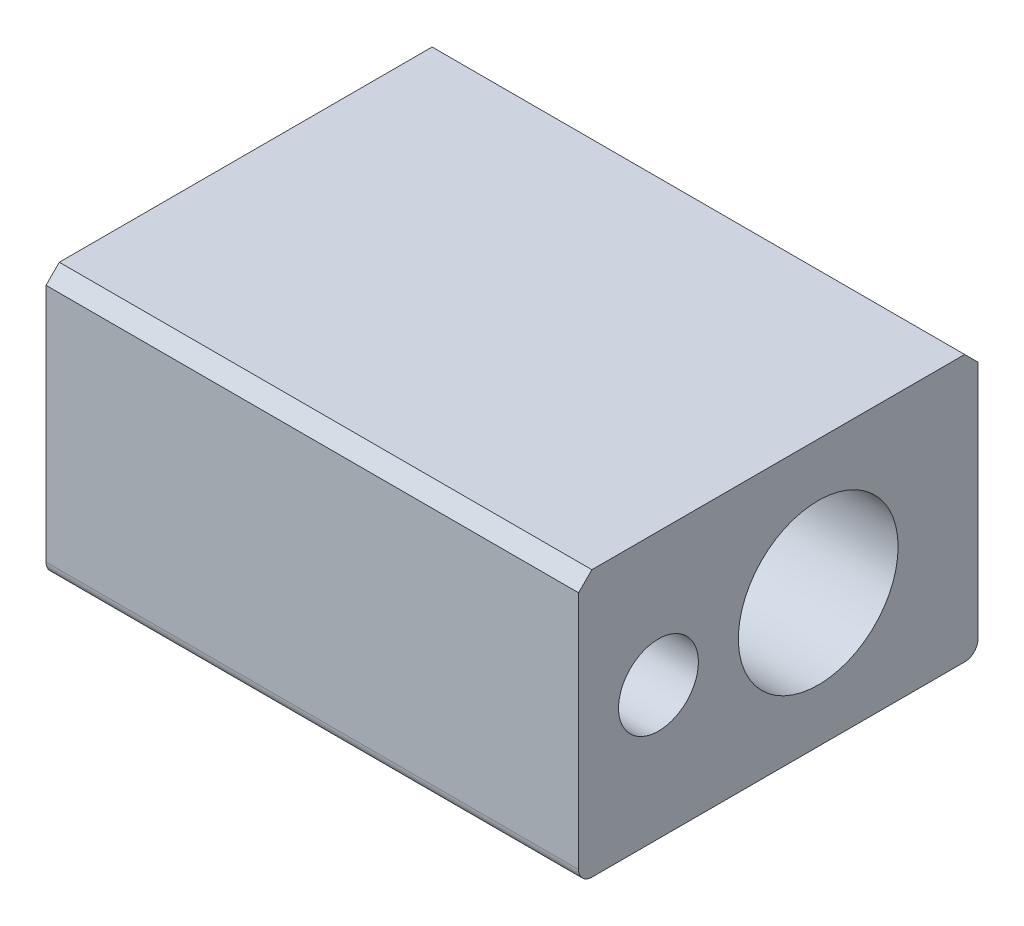
ISO-10303-21;
HEADER;
FILE_DESCRIPTION(('STEP AP214'),'2;1');
FILE_NAME('part.step','',(''),(''),'','','');
FILE_SCHEMA(('AUTOMOTIVE_DESIGN { 1 0 10303 214 1 1 1 1 }'));
ENDSEC;
DATA;
#1=APPLICATION_CONTEXT('core data for automotive mechanical design processes');
#2=APPLICATION_PROTOCOL_DEFINITION('international standard','automotive_design',2000,#1);
#3=PRODUCT_CONTEXT('',#1,'mechanical');
#4=PRODUCT('Part','Part','',(#3));
#5=PRODUCT_RELATED_PRODUCT_CATEGORY('part','',(#4));
#6=PRODUCT_DEFINITION_FORMATION('','',#4);
#7=PRODUCT_DEFINITION_CONTEXT('part definition',#1,'design');
#8=PRODUCT_DEFINITION('design','',#6,#7);
#9=PRODUCT_DEFINITION_SHAPE('','',#8);
#10=(LENGTH_UNIT() NAMED_UNIT(*) SI_UNIT(.MILLI.,.METRE.));
#11=(NAMED_UNIT(*) PLANE_ANGLE_UNIT() SI_UNIT($,.RADIAN.));
#12=(NAMED_UNIT(*) SI_UNIT($,.STERADIAN.) SOLID_ANGLE_UNIT());
#13=UNCERTAINTY_MEASURE_WITH_UNIT(LENGTH_MEASURE(1.E-05),#10,'distance_accuracy_value','');
#14=(GEOMETRIC_REPRESENTATION_CONTEXT(3) GLOBAL_UNCERTAINTY_ASSIGNED_CONTEXT((#13)) GLOBAL_UNIT_ASSIGNED_CONTEXT((#10,
#11,#12)) REPRESENTATION_CONTEXT('',''));
#15=CARTESIAN_POINT('',(0.,0.,0.));
#16=DIRECTION('',(0.,0.,1.));
#17=DIRECTION('',(1.,0.,0.));
#18=AXIS2_PLACEMENT_3D('',#15,#16,#17);
#19=CARTESIAN_POINT('',(101.6,0.,0.));
#20=DIRECTION('',(1.,0.,0.));
#21=DIRECTION('',(0.,0.,-1.));
#22=AXIS2_PLACEMENT_3D('',#19,#20,#21);
#23=PLANE('',#22);
#24=CARTESIAN_POINT('',(101.6,0.,-7.62000000000001));
#25=DIRECTION('',(1.,0.,0.));
#26=DIRECTION('',(0.,0.,-1.));
#27=AXIS2_PLACEMENT_3D('',#24,#25,#26);
#28=CIRCLE('',#27,15.24);
#29=CARTESIAN_POINT('',(101.6,0.,-22.86));
#30=VERTEX_POINT('',#29);
#31=EDGE_CURVE('E150',#30,#30,#28,.T.);
#32=ORIENTED_EDGE('',*,*,#31,.F.);
#33=EDGE_LOOP('',(#32));
#34=FACE_BOUND('',#33,.T.);
#35=DIRECTION('',(0.,1.,0.));
#36=VECTOR('',#35,1.);
#37=CARTESIAN_POINT('',(101.6,25.4,-38.1));
#38=LINE('',#37,#36);
#39=CARTESIAN_POINT('',(101.6,-22.86,-38.1));
#40=VERTEX_POINT('',#39);
#41=CARTESIAN_POINT('',(101.6,22.86,-38.1));
#42=VERTEX_POINT('',#41);
#43=EDGE_CURVE('E133',#40,#42,#38,.T.);
#44=ORIENTED_EDGE('',*,*,#43,.T.);
#45=DIRECTION('',(0.,-0.707106781186549,-0.707106781186546));
#46=VECTOR('',#45,1.);
#47=CARTESIAN_POINT('',(101.6,30.4799999999999,-30.4800000000001));
#48=LINE('',#47,#46);
#49=CARTESIAN_POINT('',(101.6,25.4,-35.56));
#50=VERTEX_POINT('',#49);
#51=EDGE_CURVE('E57',#42,#50,#48,.F.);
#52=ORIENTED_EDGE('',*,*,#51,.T.);
#53=DIRECTION('',(0.,0.,1.));
#54=VECTOR('',#53,1.);
#55=CARTESIAN_POINT('',(101.6,25.4,-38.1));
#56=LINE('',#55,#54);
#57=CARTESIAN_POINT('',(101.6,25.4,35.56));
#58=VERTEX_POINT('',#57);
#59=EDGE_CURVE('E194',#50,#58,#56,.T.);
#60=ORIENTED_EDGE('',*,*,#59,.T.);
#61=DIRECTION('',(0.,0.707106781186545,-0.70710678118655));
#62=VECTOR('',#61,1.);
#63=CARTESIAN_POINT('',(101.6,30.4800000000001,30.4799999999999));
#64=LINE('',#63,#62);
#65=CARTESIAN_POINT('',(101.6,22.86,38.1));
#66=VERTEX_POINT('',#65);
#67=EDGE_CURVE('E64',#58,#66,#64,.F.);
#68=ORIENTED_EDGE('',*,*,#67,.T.);
#69=DIRECTION('',(0.,-1.,0.));
#70=VECTOR('',#69,1.);
#71=CARTESIAN_POINT('',(101.6,25.4,38.1));
#72=LINE('',#71,#70);
#73=CARTESIAN_POINT('',(101.6,-22.86,38.1));
#74=VERTEX_POINT('',#73);
#75=EDGE_CURVE('E135',#66,#74,#72,.T.);
#76=ORIENTED_EDGE('',*,*,#75,.T.);
#77=CARTESIAN_POINT('',(101.6,-22.86,35.56));
#78=DIRECTION('',(1.,0.,0.));
#79=DIRECTION('',(0.,0.,-1.));
#80=AXIS2_PLACEMENT_3D('',#77,#78,#79);
#81=CIRCLE('',#80,2.54);
#82=CARTESIAN_POINT('',(101.6,-25.4,35.56));
#83=VERTEX_POINT('',#82);
#84=EDGE_CURVE('E165',#74,#83,#81,.T.);
#85=ORIENTED_EDGE('',*,*,#84,.T.);
#86=DIRECTION('',(0.,0.,-1.));
#87=VECTOR('',#86,1.);
#88=CARTESIAN_POINT('',(101.6,-25.4,-38.1));
#89=LINE('',#88,#87);
#90=CARTESIAN_POINT('',(101.6,-25.4,-35.56));
#91=VERTEX_POINT('',#90);
#92=EDGE_CURVE('E155',#83,#91,#89,.T.);
#93=ORIENTED_EDGE('',*,*,#92,.T.);
#94=CARTESIAN_POINT('',(101.6,-22.86,-35.56));
#95=DIRECTION('',(1.,0.,0.));
#96=DIRECTION('',(0.,0.,-1.));
#97=AXIS2_PLACEMENT_3D('',#94,#95,#96);
#98=CIRCLE('',#97,2.54);
#99=EDGE_CURVE('E168',#91,#40,#98,.T.);
#100=ORIENTED_EDGE('',*,*,#99,.T.);
#101=EDGE_LOOP('',(#44,#52,#60,#68,#76,#85,#93,#100));
#102=FACE_BOUND('',#101,.T.);
#103=CARTESIAN_POINT('',(101.6,0.,22.86));
#104=DIRECTION('',(1.,0.,0.));
#105=DIRECTION('',(0.,0.,-1.));
#106=AXIS2_PLACEMENT_3D('',#103,#104,#105);
#107=CIRCLE('',#106,7.62);
#108=CARTESIAN_POINT('',(101.6,0.,15.24));
#109=VERTEX_POINT('',#108);
#110=EDGE_CURVE('E250',#109,#109,#107,.T.);
#111=ORIENTED_EDGE('',*,*,#110,.F.);
#112=EDGE_LOOP('',(#111));
#113=FACE_BOUND('',#112,.T.);
#114=ADVANCED_FACE('F47',(#34,#102,#113),#23,.T.);
#115=CARTESIAN_POINT('',(0.,0.,0.));
#116=DIRECTION('',(1.,0.,0.));
#117=DIRECTION('',(0.,0.,-1.));
#118=AXIS2_PLACEMENT_3D('',#115,#116,#117);
#119=PLANE('',#118);
#120=DIRECTION('',(0.,0.,1.));
#121=VECTOR('',#120,1.);
#122=CARTESIAN_POINT('',(0.,25.4,-38.1));
#123=LINE('',#122,#121);
#124=CARTESIAN_POINT('',(0.,25.4,-35.56));
#125=VERTEX_POINT('',#124);
#126=CARTESIAN_POINT('',(0.,25.4,35.56));
#127=VERTEX_POINT('',#126);
#128=EDGE_CURVE('E142',#125,#127,#123,.T.);
#129=ORIENTED_EDGE('',*,*,#128,.F.);
#130=DIRECTION('',(0.,0.707106781186549,0.707106781186546));
#131=VECTOR('',#130,1.);
#132=CARTESIAN_POINT('',(0.,25.4,-35.56));
#133=LINE('',#132,#131);
#134=CARTESIAN_POINT('',(0.,22.86,-38.1));
#135=VERTEX_POINT('',#134);
#136=EDGE_CURVE('E140',#125,#135,#133,.F.);
#137=ORIENTED_EDGE('',*,*,#136,.T.);
#138=DIRECTION('',(0.,1.,0.));
#139=VECTOR('',#138,1.);
#140=CARTESIAN_POINT('',(0.,25.4,-38.1));
#141=LINE('',#140,#139);
#142=CARTESIAN_POINT('',(0.,-22.86,-38.1));
#143=VERTEX_POINT('',#142);
#144=EDGE_CURVE('E132',#143,#135,#141,.T.);
#145=ORIENTED_EDGE('',*,*,#144,.F.);
#146=CARTESIAN_POINT('',(0.,-22.86,-35.56));
#147=DIRECTION('',(1.,0.,0.));
#148=DIRECTION('',(0.,0.,-1.));
#149=AXIS2_PLACEMENT_3D('',#146,#147,#148);
#150=CIRCLE('',#149,2.54);
#151=CARTESIAN_POINT('',(0.,-25.4,-35.56));
#152=VERTEX_POINT('',#151);
#153=EDGE_CURVE('E117',#143,#152,#150,.F.);
#154=ORIENTED_EDGE('',*,*,#153,.T.);
#155=DIRECTION('',(0.,0.,-1.));
#156=VECTOR('',#155,1.);
#157=CARTESIAN_POINT('',(0.,-25.4,-38.1));
#158=LINE('',#157,#156);
#159=CARTESIAN_POINT('',(0.,-25.4,35.56));
#160=VERTEX_POINT('',#159);
#161=EDGE_CURVE('E143',#160,#152,#158,.T.);
#162=ORIENTED_EDGE('',*,*,#161,.F.);
#163=CARTESIAN_POINT('',(0.,-22.86,35.56));
#164=DIRECTION('',(1.,0.,0.));
#165=DIRECTION('',(0.,0.,-1.));
#166=AXIS2_PLACEMENT_3D('',#163,#164,#165);
#167=CIRCLE('',#166,2.54);
#168=CARTESIAN_POINT('',(0.,-22.86,38.1));
#169=VERTEX_POINT('',#168);
#170=EDGE_CURVE('E129',#160,#169,#167,.F.);
#171=ORIENTED_EDGE('',*,*,#170,.T.);
#172=DIRECTION('',(0.,-1.,0.));
#173=VECTOR('',#172,1.);
#174=CARTESIAN_POINT('',(0.,25.4,38.1));
#175=LINE('',#174,#173);
#176=CARTESIAN_POINT('',(0.,22.86,38.1));
#177=VERTEX_POINT('',#176);
#178=EDGE_CURVE('E148',#177,#169,#175,.T.);
#179=ORIENTED_EDGE('',*,*,#178,.F.);
#180=DIRECTION('',(0.,-0.707106781186545,0.70710678118655));
#181=VECTOR('',#180,1.);
#182=CARTESIAN_POINT('',(0.,22.86,38.1));
#183=LINE('',#182,#181);
#184=EDGE_CURVE('E182',#177,#127,#183,.F.);
#185=ORIENTED_EDGE('',*,*,#184,.T.);
#186=EDGE_LOOP('',(#129,#137,#145,#154,#162,#171,#179,#185));
#187=FACE_BOUND('',#186,.T.);
#188=CARTESIAN_POINT('',(0.,0.,-7.62000000000001));
#189=DIRECTION('',(1.,0.,0.));
#190=DIRECTION('',(0.,0.,-1.));
#191=AXIS2_PLACEMENT_3D('',#188,#189,#190);
#192=CIRCLE('',#191,15.24);
#193=CARTESIAN_POINT('',(0.,0.,-22.86));
#194=VERTEX_POINT('',#193);
#195=EDGE_CURVE('E258',#194,#194,#192,.T.);
#196=ORIENTED_EDGE('',*,*,#195,.T.);
#197=EDGE_LOOP('',(#196));
#198=FACE_BOUND('',#197,.T.);
#199=CARTESIAN_POINT('',(0.,0.,22.86));
#200=DIRECTION('',(1.,0.,0.));
#201=DIRECTION('',(0.,0.,-1.));
#202=AXIS2_PLACEMENT_3D('',#199,#200,#201);
#203=CIRCLE('',#202,7.62);
#204=CARTESIAN_POINT('',(0.,0.,15.24));
#205=VERTEX_POINT('',#204);
#206=EDGE_CURVE('E253',#205,#205,#203,.T.);
#207=ORIENTED_EDGE('',*,*,#206,.T.);
#208=EDGE_LOOP('',(#207));
#209=FACE_BOUND('',#208,.T.);
#210=ADVANCED_FACE('F138',(#187,#198,#209),#119,.F.);
#211=CARTESIAN_POINT('',(101.6,-25.4,-38.1));
#212=DIRECTION('',(0.,1.,0.));
#213=DIRECTION('',(0.,0.,1.));
#214=AXIS2_PLACEMENT_3D('',#211,#212,#213);
#215=PLANE('',#214);
#216=ORIENTED_EDGE('',*,*,#161,.T.);
#217=DIRECTION('',(-1.,0.,0.));
#218=VECTOR('',#217,1.);
#219=CARTESIAN_POINT('',(101.6,-25.4,-35.56));
#220=LINE('',#219,#218);
#221=EDGE_CURVE('E122',#152,#91,#220,.F.);
#222=ORIENTED_EDGE('',*,*,#221,.T.);
#223=ORIENTED_EDGE('',*,*,#92,.F.);
#224=DIRECTION('',(-1.,0.,0.));
#225=VECTOR('',#224,1.);
#226=CARTESIAN_POINT('',(101.6,-25.4,35.56));
#227=LINE('',#226,#225);
#228=EDGE_CURVE('E128',#83,#160,#227,.T.);
#229=ORIENTED_EDGE('',*,*,#228,.T.);
#230=EDGE_LOOP('',(#216,#222,#223,#229));
#231=FACE_BOUND('',#230,.T.);
#232=ADVANCED_FACE('F220',(#231),#215,.F.);
#233=CARTESIAN_POINT('',(101.6,25.4,-38.1));
#234=DIRECTION('',(0.,0.,1.));
#235=DIRECTION('',(0.,-1.,0.));
#236=AXIS2_PLACEMENT_3D('',#233,#234,#235);
#237=PLANE('',#236);
#238=ORIENTED_EDGE('',*,*,#144,.T.);
#239=DIRECTION('',(1.,0.,0.));
#240=VECTOR('',#239,1.);
#241=CARTESIAN_POINT('',(101.6,22.86,-38.1));
#242=LINE('',#241,#240);
#243=EDGE_CURVE('E72',#135,#42,#242,.T.);
#244=ORIENTED_EDGE('',*,*,#243,.T.);
#245=ORIENTED_EDGE('',*,*,#43,.F.);
#246=DIRECTION('',(-1.,0.,0.));
#247=VECTOR('',#246,1.);
#248=CARTESIAN_POINT('',(101.6,-22.86,-38.1));
#249=LINE('',#248,#247);
#250=EDGE_CURVE('E121',#40,#143,#249,.T.);
#251=ORIENTED_EDGE('',*,*,#250,.T.);
#252=EDGE_LOOP('',(#238,#244,#245,#251));
#253=FACE_BOUND('',#252,.T.);
#254=ADVANCED_FACE('F131',(#253),#237,.F.);
#255=CARTESIAN_POINT('',(101.6,25.4,-38.1));
#256=DIRECTION('',(0.,-1.,0.));
#257=DIRECTION('',(0.,0.,-1.));
#258=AXIS2_PLACEMENT_3D('',#255,#256,#257);
#259=PLANE('',#258);
#260=ORIENTED_EDGE('',*,*,#59,.F.);
#261=DIRECTION('',(-1.,0.,0.));
#262=VECTOR('',#261,1.);
#263=CARTESIAN_POINT('',(101.6,25.4,-35.56));
#264=LINE('',#263,#262);
#265=EDGE_CURVE('E178',#50,#125,#264,.T.);
#266=ORIENTED_EDGE('',*,*,#265,.T.);
#267=ORIENTED_EDGE('',*,*,#128,.T.);
#268=DIRECTION('',(1.,0.,0.));
#269=VECTOR('',#268,1.);
#270=CARTESIAN_POINT('',(101.6,25.4,35.56));
#271=LINE('',#270,#269);
#272=EDGE_CURVE('E175',#127,#58,#271,.T.);
#273=ORIENTED_EDGE('',*,*,#272,.T.);
#274=EDGE_LOOP('',(#260,#266,#267,#273));
#275=FACE_BOUND('',#274,.T.);
#276=ADVANCED_FACE('F198',(#275),#259,.F.);
#277=CARTESIAN_POINT('',(101.6,25.4,38.1));
#278=DIRECTION('',(0.,0.,-1.));
#279=DIRECTION('',(-1.,0.,0.));
#280=AXIS2_PLACEMENT_3D('',#277,#278,#279);
#281=PLANE('',#280);
#282=ORIENTED_EDGE('',*,*,#75,.F.);
#283=DIRECTION('',(-1.,0.,0.));
#284=VECTOR('',#283,1.);
#285=CARTESIAN_POINT('',(101.6,22.86,38.1));
#286=LINE('',#285,#284);
#287=EDGE_CURVE('E11',#66,#177,#286,.T.);
#288=ORIENTED_EDGE('',*,*,#287,.T.);
#289=ORIENTED_EDGE('',*,*,#178,.T.);
#290=DIRECTION('',(-1.,0.,0.));
#291=VECTOR('',#290,1.);
#292=CARTESIAN_POINT('',(101.6,-22.86,38.1));
#293=LINE('',#292,#291);
#294=EDGE_CURVE('E171',#169,#74,#293,.F.);
#295=ORIENTED_EDGE('',*,*,#294,.T.);
#296=EDGE_LOOP('',(#282,#288,#289,#295));
#297=FACE_BOUND('',#296,.T.);
#298=ADVANCED_FACE('F227',(#297),#281,.F.);
#299=CARTESIAN_POINT('',(101.6,0.,-7.62000000000001));
#300=DIRECTION('',(-1.,0.,0.));
#301=DIRECTION('',(0.,0.,1.));
#302=AXIS2_PLACEMENT_3D('',#299,#300,#301);
#303=CYLINDRICAL_SURFACE('',#302,15.24);
#304=ORIENTED_EDGE('',*,*,#31,.T.);
#305=EDGE_LOOP('',(#304));
#306=FACE_BOUND('',#305,.T.);
#307=ORIENTED_EDGE('',*,*,#195,.F.);
#308=EDGE_LOOP('',(#307));
#309=FACE_BOUND('',#308,.T.);
#310=ADVANCED_FACE('F224',(#306,#309),#303,.F.);
#311=CARTESIAN_POINT('',(101.6,0.,22.86));
#312=DIRECTION('',(-1.,0.,0.));
#313=DIRECTION('',(0.,0.,1.));
#314=AXIS2_PLACEMENT_3D('',#311,#312,#313);
#315=CYLINDRICAL_SURFACE('',#314,7.62);
#316=ORIENTED_EDGE('',*,*,#110,.T.);
#317=EDGE_LOOP('',(#316));
#318=FACE_BOUND('',#317,.T.);
#319=ORIENTED_EDGE('',*,*,#206,.F.);
#320=EDGE_LOOP('',(#319));
#321=FACE_BOUND('',#320,.T.);
#322=ADVANCED_FACE('F238',(#318,#321),#315,.F.);
#323=CARTESIAN_POINT('',(101.6,-22.86,-35.56));
#324=DIRECTION('',(-1.,0.,0.));
#325=DIRECTION('',(0.,0.,1.));
#326=AXIS2_PLACEMENT_3D('',#323,#324,#325);
#327=CYLINDRICAL_SURFACE('',#326,2.54);
#328=ORIENTED_EDGE('',*,*,#99,.F.);
#329=ORIENTED_EDGE('',*,*,#221,.F.);
#330=ORIENTED_EDGE('',*,*,#153,.F.);
#331=ORIENTED_EDGE('',*,*,#250,.F.);
#332=EDGE_LOOP('',(#328,#329,#330,#331));
#333=FACE_BOUND('',#332,.T.);
#334=ADVANCED_FACE('F120',(#333),#327,.T.);
#335=CARTESIAN_POINT('',(101.6,-22.86,35.56));
#336=DIRECTION('',(-1.,0.,0.));
#337=DIRECTION('',(0.,0.,1.));
#338=AXIS2_PLACEMENT_3D('',#335,#336,#337);
#339=CYLINDRICAL_SURFACE('',#338,2.54);
#340=ORIENTED_EDGE('',*,*,#84,.F.);
#341=ORIENTED_EDGE('',*,*,#294,.F.);
#342=ORIENTED_EDGE('',*,*,#170,.F.);
#343=ORIENTED_EDGE('',*,*,#228,.F.);
#344=EDGE_LOOP('',(#340,#341,#342,#343));
#345=FACE_BOUND('',#344,.T.);
#346=ADVANCED_FACE('F204',(#345),#339,.T.);
#347=CARTESIAN_POINT('',(101.6,25.4,-35.56));
#348=DIRECTION('',(0.,-0.707106781186546,0.707106781186549));
#349=DIRECTION('',(-1.,0.,0.));
#350=AXIS2_PLACEMENT_3D('',#347,#348,#349);
#351=PLANE('',#350);
#352=ORIENTED_EDGE('',*,*,#51,.F.);
#353=ORIENTED_EDGE('',*,*,#243,.F.);
#354=ORIENTED_EDGE('',*,*,#136,.F.);
#355=ORIENTED_EDGE('',*,*,#265,.F.);
#356=EDGE_LOOP('',(#352,#353,#354,#355));
#357=FACE_BOUND('',#356,.T.);
#358=ADVANCED_FACE('F202',(#357),#351,.F.);
#359=CARTESIAN_POINT('',(101.6,22.86,38.1));
#360=DIRECTION('',(0.,-0.70710678118655,-0.707106781186545));
#361=DIRECTION('',(-1.,0.,0.));
#362=AXIS2_PLACEMENT_3D('',#359,#360,#361);
#363=PLANE('',#362);
#364=ORIENTED_EDGE('',*,*,#67,.F.);
#365=ORIENTED_EDGE('',*,*,#272,.F.);
#366=ORIENTED_EDGE('',*,*,#184,.F.);
#367=ORIENTED_EDGE('',*,*,#287,.F.);
#368=EDGE_LOOP('',(#364,#365,#366,#367));
#369=FACE_BOUND('',#368,.T.);
#370=ADVANCED_FACE('F50',(#369),#363,.F.);
#371=CLOSED_SHELL('',(#114,#210,#232,#254,#276,#298,#310,#322,#334,#346,#358,#370));
#372=MANIFOLD_SOLID_BREP('B2',#371);
#373=ADVANCED_BREP_SHAPE_REPRESENTATION('',(#18,#372),#14);
#374=SHAPE_DEFINITION_REPRESENTATION(#9,#373);
ENDSEC;
END-ISO-10303-21;
